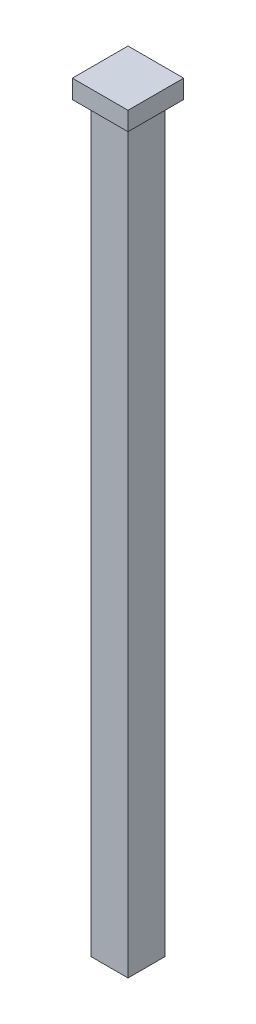
ISO-10303-21;
HEADER;
FILE_DESCRIPTION(('STEP AP214'),'2;1');
FILE_NAME('part.step','',(''),(''),'','','');
FILE_SCHEMA(('AUTOMOTIVE_DESIGN { 1 0 10303 214 1 1 1 1 }'));
ENDSEC;
DATA;
#1=APPLICATION_CONTEXT('core data for automotive mechanical design processes');
#2=APPLICATION_PROTOCOL_DEFINITION('international standard','automotive_design',2000,#1);
#3=PRODUCT_CONTEXT('',#1,'mechanical');
#4=PRODUCT('Part','Part','',(#3));
#5=PRODUCT_RELATED_PRODUCT_CATEGORY('part','',(#4));
#6=PRODUCT_DEFINITION_FORMATION('','',#4);
#7=PRODUCT_DEFINITION_CONTEXT('part definition',#1,'design');
#8=PRODUCT_DEFINITION('design','',#6,#7);
#9=PRODUCT_DEFINITION_SHAPE('','',#8);
#10=(LENGTH_UNIT() NAMED_UNIT(*) SI_UNIT(.MILLI.,.METRE.));
#11=(NAMED_UNIT(*) PLANE_ANGLE_UNIT() SI_UNIT($,.RADIAN.));
#12=(NAMED_UNIT(*) SI_UNIT($,.STERADIAN.) SOLID_ANGLE_UNIT());
#13=UNCERTAINTY_MEASURE_WITH_UNIT(LENGTH_MEASURE(1.E-05),#10,'distance_accuracy_value','');
#14=(GEOMETRIC_REPRESENTATION_CONTEXT(3) GLOBAL_UNCERTAINTY_ASSIGNED_CONTEXT((#13)) GLOBAL_UNIT_ASSIGNED_CONTEXT((#10,
#11,#12)) REPRESENTATION_CONTEXT('',''));
#15=CARTESIAN_POINT('',(0.,0.,0.));
#16=DIRECTION('',(0.,0.,1.));
#17=DIRECTION('',(1.,0.,0.));
#18=AXIS2_PLACEMENT_3D('',#15,#16,#17);
#19=CARTESIAN_POINT('',(0.,0.,0.));
#20=DIRECTION('',(0.,1.,0.));
#21=DIRECTION('',(0.,0.,1.));
#22=AXIS2_PLACEMENT_3D('',#19,#20,#21);
#23=PLANE('',#22);
#24=DIRECTION('',(0.,0.,-1.));
#25=VECTOR('',#24,1.);
#26=CARTESIAN_POINT('',(75.,0.,-75.));
#27=LINE('',#26,#25);
#28=CARTESIAN_POINT('',(75.,0.,75.));
#29=VERTEX_POINT('',#28);
#30=CARTESIAN_POINT('',(75.,0.,-75.));
#31=VERTEX_POINT('',#30);
#32=EDGE_CURVE('E117',#29,#31,#27,.T.);
#33=ORIENTED_EDGE('',*,*,#32,.F.);
#34=DIRECTION('',(1.,0.,0.));
#35=VECTOR('',#34,1.);
#36=CARTESIAN_POINT('',(-75.,0.,75.));
#37=LINE('',#36,#35);
#38=CARTESIAN_POINT('',(-75.,0.,75.));
#39=VERTEX_POINT('',#38);
#40=EDGE_CURVE('E130',#39,#29,#37,.T.);
#41=ORIENTED_EDGE('',*,*,#40,.F.);
#42=DIRECTION('',(0.,0.,1.));
#43=VECTOR('',#42,1.);
#44=CARTESIAN_POINT('',(-75.,0.,-75.));
#45=LINE('',#44,#43);
#46=CARTESIAN_POINT('',(-75.,0.,-75.));
#47=VERTEX_POINT('',#46);
#48=EDGE_CURVE('E138',#47,#39,#45,.T.);
#49=ORIENTED_EDGE('',*,*,#48,.F.);
#50=DIRECTION('',(-1.,0.,0.));
#51=VECTOR('',#50,1.);
#52=CARTESIAN_POINT('',(-75.,0.,-75.));
#53=LINE('',#52,#51);
#54=EDGE_CURVE('E120',#31,#47,#53,.T.);
#55=ORIENTED_EDGE('',*,*,#54,.F.);
#56=EDGE_LOOP('',(#33,#41,#49,#55));
#57=FACE_BOUND('',#56,.T.);
#58=DIRECTION('',(0.,0.,1.));
#59=VECTOR('',#58,1.);
#60=CARTESIAN_POINT('',(50.,0.,50.));
#61=LINE('',#60,#59);
#62=CARTESIAN_POINT('',(50.,0.,-50.));
#63=VERTEX_POINT('',#62);
#64=CARTESIAN_POINT('',(50.,0.,50.));
#65=VERTEX_POINT('',#64);
#66=EDGE_CURVE('E47',#63,#65,#61,.T.);
#67=ORIENTED_EDGE('',*,*,#66,.F.);
#68=DIRECTION('',(1.,0.,0.));
#69=VECTOR('',#68,1.);
#70=CARTESIAN_POINT('',(-50.,0.,-50.));
#71=LINE('',#70,#69);
#72=CARTESIAN_POINT('',(-50.,0.,-50.));
#73=VERTEX_POINT('',#72);
#74=EDGE_CURVE('E51',#73,#63,#71,.T.);
#75=ORIENTED_EDGE('',*,*,#74,.F.);
#76=DIRECTION('',(0.,0.,-1.));
#77=VECTOR('',#76,1.);
#78=CARTESIAN_POINT('',(-50.,0.,50.));
#79=LINE('',#78,#77);
#80=CARTESIAN_POINT('',(-50.,0.,50.));
#81=VERTEX_POINT('',#80);
#82=EDGE_CURVE('E225',#81,#73,#79,.T.);
#83=ORIENTED_EDGE('',*,*,#82,.F.);
#84=DIRECTION('',(-1.,0.,0.));
#85=VECTOR('',#84,1.);
#86=CARTESIAN_POINT('',(-50.,0.,50.));
#87=LINE('',#86,#85);
#88=EDGE_CURVE('E216',#65,#81,#87,.T.);
#89=ORIENTED_EDGE('',*,*,#88,.F.);
#90=EDGE_LOOP('',(#67,#75,#83,#89));
#91=FACE_BOUND('',#90,.T.);
#92=ADVANCED_FACE('F32',(#57,#91),#23,.F.);
#93=CARTESIAN_POINT('',(75.,50.,-75.));
#94=DIRECTION('',(-1.,0.,0.));
#95=DIRECTION('',(0.,0.,1.));
#96=AXIS2_PLACEMENT_3D('',#93,#94,#95);
#97=PLANE('',#96);
#98=ORIENTED_EDGE('',*,*,#32,.T.);
#99=DIRECTION('',(0.,-1.,0.));
#100=VECTOR('',#99,1.);
#101=CARTESIAN_POINT('',(75.,50.,-75.));
#102=LINE('',#101,#100);
#103=CARTESIAN_POINT('',(75.,50.,-75.));
#104=VERTEX_POINT('',#103);
#105=EDGE_CURVE('E11',#104,#31,#102,.T.);
#106=ORIENTED_EDGE('',*,*,#105,.F.);
#107=DIRECTION('',(0.,0.,-1.));
#108=VECTOR('',#107,1.);
#109=CARTESIAN_POINT('',(75.,50.,-75.));
#110=LINE('',#109,#108);
#111=CARTESIAN_POINT('',(75.,50.,75.));
#112=VERTEX_POINT('',#111);
#113=EDGE_CURVE('E126',#112,#104,#110,.T.);
#114=ORIENTED_EDGE('',*,*,#113,.F.);
#115=DIRECTION('',(0.,-1.,0.));
#116=VECTOR('',#115,1.);
#117=CARTESIAN_POINT('',(75.,50.,75.));
#118=LINE('',#117,#116);
#119=EDGE_CURVE('E135',#112,#29,#118,.T.);
#120=ORIENTED_EDGE('',*,*,#119,.T.);
#121=EDGE_LOOP('',(#98,#106,#114,#120));
#122=FACE_BOUND('',#121,.T.);
#123=ADVANCED_FACE('F34',(#122),#97,.F.);
#124=CARTESIAN_POINT('',(-75.,50.,-75.));
#125=DIRECTION('',(0.,0.,1.));
#126=DIRECTION('',(1.,0.,0.));
#127=AXIS2_PLACEMENT_3D('',#124,#125,#126);
#128=PLANE('',#127);
#129=ORIENTED_EDGE('',*,*,#54,.T.);
#130=DIRECTION('',(0.,-1.,0.));
#131=VECTOR('',#130,1.);
#132=CARTESIAN_POINT('',(-75.,50.,-75.));
#133=LINE('',#132,#131);
#134=CARTESIAN_POINT('',(-75.,50.,-75.));
#135=VERTEX_POINT('',#134);
#136=EDGE_CURVE('E40',#135,#47,#133,.T.);
#137=ORIENTED_EDGE('',*,*,#136,.F.);
#138=DIRECTION('',(-1.,0.,0.));
#139=VECTOR('',#138,1.);
#140=CARTESIAN_POINT('',(-75.,50.,-75.));
#141=LINE('',#140,#139);
#142=EDGE_CURVE('E129',#104,#135,#141,.T.);
#143=ORIENTED_EDGE('',*,*,#142,.F.);
#144=ORIENTED_EDGE('',*,*,#105,.T.);
#145=EDGE_LOOP('',(#129,#137,#143,#144));
#146=FACE_BOUND('',#145,.T.);
#147=ADVANCED_FACE('F165',(#146),#128,.F.);
#148=CARTESIAN_POINT('',(-75.,50.,-75.));
#149=DIRECTION('',(1.,0.,0.));
#150=DIRECTION('',(0.,0.,-1.));
#151=AXIS2_PLACEMENT_3D('',#148,#149,#150);
#152=PLANE('',#151);
#153=ORIENTED_EDGE('',*,*,#48,.T.);
#154=DIRECTION('',(0.,-1.,0.));
#155=VECTOR('',#154,1.);
#156=CARTESIAN_POINT('',(-75.,50.,75.));
#157=LINE('',#156,#155);
#158=CARTESIAN_POINT('',(-75.,50.,75.));
#159=VERTEX_POINT('',#158);
#160=EDGE_CURVE('E143',#159,#39,#157,.T.);
#161=ORIENTED_EDGE('',*,*,#160,.F.);
#162=DIRECTION('',(0.,0.,1.));
#163=VECTOR('',#162,1.);
#164=CARTESIAN_POINT('',(-75.,50.,-75.));
#165=LINE('',#164,#163);
#166=EDGE_CURVE('E132',#135,#159,#165,.T.);
#167=ORIENTED_EDGE('',*,*,#166,.F.);
#168=ORIENTED_EDGE('',*,*,#136,.T.);
#169=EDGE_LOOP('',(#153,#161,#167,#168));
#170=FACE_BOUND('',#169,.T.);
#171=ADVANCED_FACE('F150',(#170),#152,.F.);
#172=CARTESIAN_POINT('',(-75.,50.,75.));
#173=DIRECTION('',(0.,0.,-1.));
#174=DIRECTION('',(-1.,0.,0.));
#175=AXIS2_PLACEMENT_3D('',#172,#173,#174);
#176=PLANE('',#175);
#177=ORIENTED_EDGE('',*,*,#40,.T.);
#178=ORIENTED_EDGE('',*,*,#119,.F.);
#179=DIRECTION('',(1.,0.,0.));
#180=VECTOR('',#179,1.);
#181=CARTESIAN_POINT('',(-75.,50.,75.));
#182=LINE('',#181,#180);
#183=EDGE_CURVE('E134',#159,#112,#182,.T.);
#184=ORIENTED_EDGE('',*,*,#183,.F.);
#185=ORIENTED_EDGE('',*,*,#160,.T.);
#186=EDGE_LOOP('',(#177,#178,#184,#185));
#187=FACE_BOUND('',#186,.T.);
#188=ADVANCED_FACE('F158',(#187),#176,.F.);
#189=CARTESIAN_POINT('',(0.,50.,0.));
#190=DIRECTION('',(0.,1.,0.));
#191=DIRECTION('',(0.,0.,1.));
#192=AXIS2_PLACEMENT_3D('',#189,#190,#191);
#193=PLANE('',#192);
#194=ORIENTED_EDGE('',*,*,#113,.T.);
#195=ORIENTED_EDGE('',*,*,#142,.T.);
#196=ORIENTED_EDGE('',*,*,#166,.T.);
#197=ORIENTED_EDGE('',*,*,#183,.T.);
#198=EDGE_LOOP('',(#194,#195,#196,#197));
#199=FACE_BOUND('',#198,.T.);
#200=ADVANCED_FACE('F164',(#199),#193,.T.);
#201=CARTESIAN_POINT('',(50.,-2000.,50.));
#202=DIRECTION('',(-1.,0.,0.));
#203=DIRECTION('',(0.,0.,1.));
#204=AXIS2_PLACEMENT_3D('',#201,#202,#203);
#205=PLANE('',#204);
#206=ORIENTED_EDGE('',*,*,#66,.T.);
#207=DIRECTION('',(0.,1.,0.));
#208=VECTOR('',#207,1.);
#209=CARTESIAN_POINT('',(50.,-2000.,50.));
#210=LINE('',#209,#208);
#211=CARTESIAN_POINT('',(50.,-2000.,50.));
#212=VERTEX_POINT('',#211);
#213=EDGE_CURVE('E100',#212,#65,#210,.T.);
#214=ORIENTED_EDGE('',*,*,#213,.F.);
#215=DIRECTION('',(0.,0.,1.));
#216=VECTOR('',#215,1.);
#217=CARTESIAN_POINT('',(50.,-2000.,50.));
#218=LINE('',#217,#216);
#219=CARTESIAN_POINT('',(50.,-2000.,-50.));
#220=VERTEX_POINT('',#219);
#221=EDGE_CURVE('E106',#220,#212,#218,.T.);
#222=ORIENTED_EDGE('',*,*,#221,.F.);
#223=DIRECTION('',(0.,1.,0.));
#224=VECTOR('',#223,1.);
#225=CARTESIAN_POINT('',(50.,-2000.,-50.));
#226=LINE('',#225,#224);
#227=EDGE_CURVE('E222',#220,#63,#226,.T.);
#228=ORIENTED_EDGE('',*,*,#227,.T.);
#229=EDGE_LOOP('',(#206,#214,#222,#228));
#230=FACE_BOUND('',#229,.T.);
#231=ADVANCED_FACE('F116',(#230),#205,.F.);
#232=CARTESIAN_POINT('',(-50.,-2000.,50.));
#233=DIRECTION('',(0.,0.,-1.));
#234=DIRECTION('',(-1.,0.,0.));
#235=AXIS2_PLACEMENT_3D('',#232,#233,#234);
#236=PLANE('',#235);
#237=ORIENTED_EDGE('',*,*,#88,.T.);
#238=DIRECTION('',(0.,1.,0.));
#239=VECTOR('',#238,1.);
#240=CARTESIAN_POINT('',(-50.,-2000.,50.));
#241=LINE('',#240,#239);
#242=CARTESIAN_POINT('',(-50.,-2000.,50.));
#243=VERTEX_POINT('',#242);
#244=EDGE_CURVE('E102',#243,#81,#241,.T.);
#245=ORIENTED_EDGE('',*,*,#244,.F.);
#246=DIRECTION('',(-1.,0.,0.));
#247=VECTOR('',#246,1.);
#248=CARTESIAN_POINT('',(-50.,-2000.,50.));
#249=LINE('',#248,#247);
#250=EDGE_CURVE('E95',#212,#243,#249,.T.);
#251=ORIENTED_EDGE('',*,*,#250,.F.);
#252=ORIENTED_EDGE('',*,*,#213,.T.);
#253=EDGE_LOOP('',(#237,#245,#251,#252));
#254=FACE_BOUND('',#253,.T.);
#255=ADVANCED_FACE('F98',(#254),#236,.F.);
#256=CARTESIAN_POINT('',(-50.,-2000.,50.));
#257=DIRECTION('',(1.,0.,0.));
#258=DIRECTION('',(0.,0.,-1.));
#259=AXIS2_PLACEMENT_3D('',#256,#257,#258);
#260=PLANE('',#259);
#261=ORIENTED_EDGE('',*,*,#82,.T.);
#262=DIRECTION('',(0.,1.,0.));
#263=VECTOR('',#262,1.);
#264=CARTESIAN_POINT('',(-50.,-2000.,-50.));
#265=LINE('',#264,#263);
#266=CARTESIAN_POINT('',(-50.,-2000.,-50.));
#267=VERTEX_POINT('',#266);
#268=EDGE_CURVE('E122',#267,#73,#265,.T.);
#269=ORIENTED_EDGE('',*,*,#268,.F.);
#270=DIRECTION('',(0.,0.,-1.));
#271=VECTOR('',#270,1.);
#272=CARTESIAN_POINT('',(-50.,-2000.,50.));
#273=LINE('',#272,#271);
#274=EDGE_CURVE('E105',#243,#267,#273,.T.);
#275=ORIENTED_EDGE('',*,*,#274,.F.);
#276=ORIENTED_EDGE('',*,*,#244,.T.);
#277=EDGE_LOOP('',(#261,#269,#275,#276));
#278=FACE_BOUND('',#277,.T.);
#279=ADVANCED_FACE('F189',(#278),#260,.F.);
#280=CARTESIAN_POINT('',(-50.,-2000.,-50.));
#281=DIRECTION('',(0.,0.,1.));
#282=DIRECTION('',(1.,0.,0.));
#283=AXIS2_PLACEMENT_3D('',#280,#281,#282);
#284=PLANE('',#283);
#285=ORIENTED_EDGE('',*,*,#74,.T.);
#286=ORIENTED_EDGE('',*,*,#227,.F.);
#287=DIRECTION('',(1.,0.,0.));
#288=VECTOR('',#287,1.);
#289=CARTESIAN_POINT('',(-50.,-2000.,-50.));
#290=LINE('',#289,#288);
#291=EDGE_CURVE('E111',#267,#220,#290,.T.);
#292=ORIENTED_EDGE('',*,*,#291,.F.);
#293=ORIENTED_EDGE('',*,*,#268,.T.);
#294=EDGE_LOOP('',(#285,#286,#292,#293));
#295=FACE_BOUND('',#294,.T.);
#296=ADVANCED_FACE('F194',(#295),#284,.F.);
#297=CARTESIAN_POINT('',(0.,-2000.,0.));
#298=DIRECTION('',(0.,-1.,0.));
#299=DIRECTION('',(0.,0.,-1.));
#300=AXIS2_PLACEMENT_3D('',#297,#298,#299);
#301=PLANE('',#300);
#302=CARTESIAN_POINT('',(0.,-2000.,0.));
#303=DIRECTION('',(0.,-1.,0.));
#304=DIRECTION('',(0.,0.,-1.));
#305=AXIS2_PLACEMENT_3D('',#302,#303,#304);
#306=CIRCLE('',#305,25.);
#307=CARTESIAN_POINT('',(0.,-2000.,-25.));
#308=VERTEX_POINT('',#307);
#309=EDGE_CURVE('E214',#308,#308,#306,.T.);
#310=ORIENTED_EDGE('',*,*,#309,.F.);
#311=EDGE_LOOP('',(#310));
#312=FACE_BOUND('',#311,.T.);
#313=ORIENTED_EDGE('',*,*,#221,.T.);
#314=ORIENTED_EDGE('',*,*,#250,.T.);
#315=ORIENTED_EDGE('',*,*,#274,.T.);
#316=ORIENTED_EDGE('',*,*,#291,.T.);
#317=EDGE_LOOP('',(#313,#314,#315,#316));
#318=FACE_BOUND('',#317,.T.);
#319=ADVANCED_FACE('F109',(#312,#318),#301,.T.);
#320=CARTESIAN_POINT('',(0.,-1975.,0.));
#321=DIRECTION('',(0.,-1.,0.));
#322=DIRECTION('',(0.,0.,-1.));
#323=AXIS2_PLACEMENT_3D('',#320,#321,#322);
#324=CYLINDRICAL_SURFACE('',#323,25.);
#325=CARTESIAN_POINT('',(0.,-1975.,0.));
#326=DIRECTION('',(0.,-1.,0.));
#327=DIRECTION('',(0.,0.,-1.));
#328=AXIS2_PLACEMENT_3D('',#325,#326,#327);
#329=CIRCLE('',#328,25.);
#330=CARTESIAN_POINT('',(0.,-1975.,-25.));
#331=VERTEX_POINT('',#330);
#332=EDGE_CURVE('E213',#331,#331,#329,.T.);
#333=ORIENTED_EDGE('',*,*,#332,.F.);
#334=EDGE_LOOP('',(#333));
#335=FACE_BOUND('',#334,.T.);
#336=ORIENTED_EDGE('',*,*,#309,.T.);
#337=EDGE_LOOP('',(#336));
#338=FACE_BOUND('',#337,.T.);
#339=ADVANCED_FACE('F201',(#335,#338),#324,.F.);
#340=CARTESIAN_POINT('',(0.,-1975.,0.));
#341=DIRECTION('',(0.,-1.,0.));
#342=DIRECTION('',(0.,0.,-1.));
#343=AXIS2_PLACEMENT_3D('',#340,#341,#342);
#344=PLANE('',#343);
#345=ORIENTED_EDGE('',*,*,#332,.T.);
#346=EDGE_LOOP('',(#345));
#347=FACE_BOUND('',#346,.T.);
#348=ADVANCED_FACE('F205',(#347),#344,.T.);
#349=CLOSED_SHELL('',(#92,#123,#147,#171,#188,#200,#231,#255,#279,#296,#319,#339,#348));
#350=MANIFOLD_SOLID_BREP('B2',#349);
#351=ADVANCED_BREP_SHAPE_REPRESENTATION('',(#18,#350),#14);
#352=SHAPE_DEFINITION_REPRESENTATION(#9,#351);
ENDSEC;
END-ISO-10303-21;
